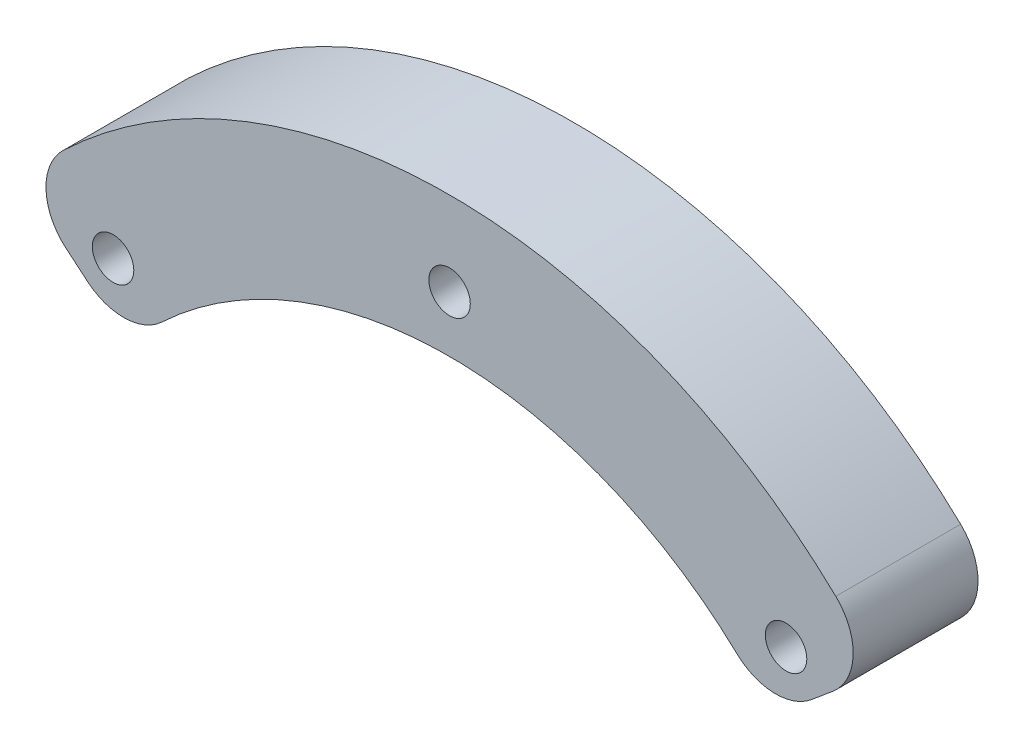
ISO-10303-21;
HEADER;
FILE_DESCRIPTION(('STEP AP214'),'2;1');
FILE_NAME('part.step','',(''),(''),'','','');
FILE_SCHEMA(('AUTOMOTIVE_DESIGN { 1 0 10303 214 1 1 1 1 }'));
ENDSEC;
DATA;
#1=APPLICATION_CONTEXT('core data for automotive mechanical design processes');
#2=APPLICATION_PROTOCOL_DEFINITION('international standard','automotive_design',2000,#1);
#3=PRODUCT_CONTEXT('',#1,'mechanical');
#4=PRODUCT('Part','Part','',(#3));
#5=PRODUCT_RELATED_PRODUCT_CATEGORY('part','',(#4));
#6=PRODUCT_DEFINITION_FORMATION('','',#4);
#7=PRODUCT_DEFINITION_CONTEXT('part definition',#1,'design');
#8=PRODUCT_DEFINITION('design','',#6,#7);
#9=PRODUCT_DEFINITION_SHAPE('','',#8);
#10=(LENGTH_UNIT() NAMED_UNIT(*) SI_UNIT(.MILLI.,.METRE.));
#11=(NAMED_UNIT(*) PLANE_ANGLE_UNIT() SI_UNIT($,.RADIAN.));
#12=(NAMED_UNIT(*) SI_UNIT($,.STERADIAN.) SOLID_ANGLE_UNIT());
#13=UNCERTAINTY_MEASURE_WITH_UNIT(LENGTH_MEASURE(1.E-05),#10,'distance_accuracy_value','');
#14=(GEOMETRIC_REPRESENTATION_CONTEXT(3) GLOBAL_UNCERTAINTY_ASSIGNED_CONTEXT((#13)) GLOBAL_UNIT_ASSIGNED_CONTEXT((#10,
#11,#12)) REPRESENTATION_CONTEXT('',''));
#15=CARTESIAN_POINT('',(0.,0.,0.));
#16=DIRECTION('',(0.,0.,1.));
#17=DIRECTION('',(1.,0.,0.));
#18=AXIS2_PLACEMENT_3D('',#15,#16,#17);
#19=CARTESIAN_POINT('',(0.,0.,11.15));
#20=DIRECTION('',(-0.642787609686544,0.766044443118974,0.));
#21=DIRECTION('',(-0.766044443118974,-0.642787609686544,0.));
#22=AXIS2_PLACEMENT_3D('',#19,#20,#21);
#23=PLANE('',#22);
#24=DIRECTION('',(0.766044443118974,0.642787609686544,0.));
#25=VECTOR('',#24,1.);
#26=CARTESIAN_POINT('',(0.,0.,0.));
#27=LINE('',#26,#25);
#28=CARTESIAN_POINT('',(32.3307965914018,27.1287594955132,0.));
#29=VERTEX_POINT('',#28);
#30=CARTESIAN_POINT('',(34.258548972,28.7463358070743,0.));
#31=VERTEX_POINT('',#30);
#32=EDGE_CURVE('E143',#29,#31,#27,.T.);
#33=ORIENTED_EDGE('',*,*,#32,.T.);
#34=DIRECTION('',(0.,0.,-1.));
#35=VECTOR('',#34,1.);
#36=CARTESIAN_POINT('',(34.258548972,28.7463358070743,11.15));
#37=LINE('',#36,#35);
#38=CARTESIAN_POINT('',(34.258548972,28.7463358070743,11.15));
#39=VERTEX_POINT('',#38);
#40=EDGE_CURVE('E117',#31,#39,#37,.F.);
#41=ORIENTED_EDGE('',*,*,#40,.T.);
#42=DIRECTION('',(0.766044443118974,0.642787609686544,0.));
#43=VECTOR('',#42,1.);
#44=CARTESIAN_POINT('',(0.,0.,11.15));
#45=LINE('',#44,#43);
#46=CARTESIAN_POINT('',(32.3307965914018,27.1287594955132,11.15));
#47=VERTEX_POINT('',#46);
#48=EDGE_CURVE('E269',#47,#39,#45,.T.);
#49=ORIENTED_EDGE('',*,*,#48,.F.);
#50=DIRECTION('',(0.,0.,1.));
#51=VECTOR('',#50,1.);
#52=CARTESIAN_POINT('',(32.3307965914018,27.1287594955132,0.));
#53=LINE('',#52,#51);
#54=EDGE_CURVE('E123',#47,#29,#53,.F.);
#55=ORIENTED_EDGE('',*,*,#54,.T.);
#56=EDGE_LOOP('',(#33,#41,#49,#55));
#57=FACE_BOUND('',#56,.T.);
#58=ADVANCED_FACE('F45',(#57),#23,.F.);
#59=CARTESIAN_POINT('',(0.,0.,11.15));
#60=DIRECTION('',(0.,0.,-1.));
#61=DIRECTION('',(-1.,0.,0.));
#62=AXIS2_PLACEMENT_3D('',#59,#60,#61);
#63=CYLINDRICAL_SURFACE('',#62,50.);
#64=CARTESIAN_POINT('',(0.,0.,11.15));
#65=DIRECTION('',(0.,0.,1.));
#66=DIRECTION('',(1.,0.,0.));
#67=AXIS2_PLACEMENT_3D('',#64,#65,#66);
#68=CIRCLE('',#67,50.);
#69=CARTESIAN_POINT('',(34.4940121372969,36.1961755807435,11.15));
#70=VERTEX_POINT('',#69);
#71=CARTESIAN_POINT('',(-34.494012137297,36.1961755807435,11.15));
#72=VERTEX_POINT('',#71);
#73=EDGE_CURVE('E133',#70,#72,#68,.T.);
#74=ORIENTED_EDGE('',*,*,#73,.F.);
#75=DIRECTION('',(0.,0.,-1.));
#76=VECTOR('',#75,1.);
#77=CARTESIAN_POINT('',(34.4940121372969,36.1961755807435,11.15));
#78=LINE('',#77,#76);
#79=CARTESIAN_POINT('',(34.4940121372969,36.1961755807435,0.));
#80=VERTEX_POINT('',#79);
#81=EDGE_CURVE('E116',#70,#80,#78,.T.);
#82=ORIENTED_EDGE('',*,*,#81,.T.);
#83=CARTESIAN_POINT('',(0.,0.,0.));
#84=DIRECTION('',(0.,0.,1.));
#85=DIRECTION('',(1.,0.,0.));
#86=AXIS2_PLACEMENT_3D('',#83,#84,#85);
#87=CIRCLE('',#86,50.);
#88=CARTESIAN_POINT('',(-34.494012137297,36.1961755807435,0.));
#89=VERTEX_POINT('',#88);
#90=EDGE_CURVE('E130',#80,#89,#87,.T.);
#91=ORIENTED_EDGE('',*,*,#90,.T.);
#92=DIRECTION('',(0.,0.,-1.));
#93=VECTOR('',#92,1.);
#94=CARTESIAN_POINT('',(-34.494012137297,36.1961755807435,11.15));
#95=LINE('',#94,#93);
#96=EDGE_CURVE('E136',#89,#72,#95,.F.);
#97=ORIENTED_EDGE('',*,*,#96,.T.);
#98=EDGE_LOOP('',(#74,#82,#91,#97));
#99=FACE_BOUND('',#98,.T.);
#100=ADVANCED_FACE('F129',(#99),#63,.T.);
#101=CARTESIAN_POINT('',(0.,0.,11.15));
#102=DIRECTION('',(-0.642787609686543,-0.766044443118975,0.));
#103=DIRECTION('',(0.766044443118975,-0.642787609686543,0.));
#104=AXIS2_PLACEMENT_3D('',#101,#102,#103);
#105=PLANE('',#104);
#106=DIRECTION('',(-0.766044443118975,0.642787609686543,0.));
#107=VECTOR('',#106,1.);
#108=CARTESIAN_POINT('',(0.,0.,0.));
#109=LINE('',#108,#107);
#110=CARTESIAN_POINT('',(-32.3307965914018,27.1287594955132,0.));
#111=VERTEX_POINT('',#110);
#112=CARTESIAN_POINT('',(-34.258548972,28.7463358070743,0.));
#113=VERTEX_POINT('',#112);
#114=EDGE_CURVE('E142',#111,#113,#109,.T.);
#115=ORIENTED_EDGE('',*,*,#114,.F.);
#116=DIRECTION('',(0.,0.,-1.));
#117=VECTOR('',#116,1.);
#118=CARTESIAN_POINT('',(-32.3307965914018,27.1287594955132,11.15));
#119=LINE('',#118,#117);
#120=CARTESIAN_POINT('',(-32.3307965914018,27.1287594955132,11.15));
#121=VERTEX_POINT('',#120);
#122=EDGE_CURVE('E11',#111,#121,#119,.F.);
#123=ORIENTED_EDGE('',*,*,#122,.T.);
#124=DIRECTION('',(-0.766044443118975,0.642787609686543,0.));
#125=VECTOR('',#124,1.);
#126=CARTESIAN_POINT('',(0.,0.,11.15));
#127=LINE('',#126,#125);
#128=CARTESIAN_POINT('',(-34.258548972,28.7463358070743,11.15));
#129=VERTEX_POINT('',#128);
#130=EDGE_CURVE('E204',#121,#129,#127,.T.);
#131=ORIENTED_EDGE('',*,*,#130,.T.);
#132=DIRECTION('',(0.,0.,1.));
#133=VECTOR('',#132,1.);
#134=CARTESIAN_POINT('',(-34.258548972,28.7463358070743,0.));
#135=LINE('',#134,#133);
#136=EDGE_CURVE('E54',#129,#113,#135,.F.);
#137=ORIENTED_EDGE('',*,*,#136,.T.);
#138=EDGE_LOOP('',(#115,#123,#131,#137));
#139=FACE_BOUND('',#138,.T.);
#140=ADVANCED_FACE('F202',(#139),#105,.T.);
#141=CARTESIAN_POINT('',(-30.0520382004283,30.0520382004283,11.15));
#142=DIRECTION('',(0.,0.,-1.));
#143=DIRECTION('',(-1.,0.,0.));
#144=AXIS2_PLACEMENT_3D('',#141,#142,#143);
#145=CYLINDRICAL_SURFACE('',#144,1.85);
#146=CARTESIAN_POINT('',(-30.0520382004283,30.0520382004283,11.15));
#147=DIRECTION('',(0.,0.,1.));
#148=DIRECTION('',(1.,0.,0.));
#149=AXIS2_PLACEMENT_3D('',#146,#147,#148);
#150=CIRCLE('',#149,1.85);
#151=CARTESIAN_POINT('',(-28.2020382004283,30.0520382004283,11.15));
#152=VERTEX_POINT('',#151);
#153=EDGE_CURVE('E214',#152,#152,#150,.T.);
#154=ORIENTED_EDGE('',*,*,#153,.T.);
#155=EDGE_LOOP('',(#154));
#156=FACE_BOUND('',#155,.T.);
#157=CARTESIAN_POINT('',(-30.0520382004283,30.0520382004283,0.));
#158=DIRECTION('',(0.,0.,1.));
#159=DIRECTION('',(1.,0.,0.));
#160=AXIS2_PLACEMENT_3D('',#157,#158,#159);
#161=CIRCLE('',#160,1.85);
#162=CARTESIAN_POINT('',(-28.2020382004283,30.0520382004283,0.));
#163=VERTEX_POINT('',#162);
#164=EDGE_CURVE('E156',#163,#163,#161,.T.);
#165=ORIENTED_EDGE('',*,*,#164,.F.);
#166=EDGE_LOOP('',(#165));
#167=FACE_BOUND('',#166,.T.);
#168=ADVANCED_FACE('F242',(#156,#167),#145,.F.);
#169=CARTESIAN_POINT('',(0.,0.,11.15));
#170=DIRECTION('',(0.,0.,-1.));
#171=DIRECTION('',(-1.,0.,0.));
#172=AXIS2_PLACEMENT_3D('',#169,#170,#171);
#173=CYLINDRICAL_SURFACE('',#172,37.5);
#174=CARTESIAN_POINT('',(0.,0.,0.));
#175=DIRECTION('',(0.,0.,1.));
#176=DIRECTION('',(1.,0.,0.));
#177=AXIS2_PLACEMENT_3D('',#174,#175,#176);
#178=CIRCLE('',#177,37.5);
#179=CARTESIAN_POINT('',(25.691345773208,27.3167485686248,0.));
#180=VERTEX_POINT('',#179);
#181=CARTESIAN_POINT('',(-25.6913457732081,27.3167485686248,0.));
#182=VERTEX_POINT('',#181);
#183=EDGE_CURVE('E147',#180,#182,#178,.T.);
#184=ORIENTED_EDGE('',*,*,#183,.F.);
#185=DIRECTION('',(0.,0.,-1.));
#186=VECTOR('',#185,1.);
#187=CARTESIAN_POINT('',(25.691345773208,27.3167485686248,11.15));
#188=LINE('',#187,#186);
#189=CARTESIAN_POINT('',(25.691345773208,27.3167485686248,11.15));
#190=VERTEX_POINT('',#189);
#191=EDGE_CURVE('E68',#180,#190,#188,.F.);
#192=ORIENTED_EDGE('',*,*,#191,.T.);
#193=CARTESIAN_POINT('',(0.,0.,11.15));
#194=DIRECTION('',(0.,0.,1.));
#195=DIRECTION('',(1.,0.,0.));
#196=AXIS2_PLACEMENT_3D('',#193,#194,#195);
#197=CIRCLE('',#196,37.5);
#198=CARTESIAN_POINT('',(-25.6913457732081,27.3167485686248,11.15));
#199=VERTEX_POINT('',#198);
#200=EDGE_CURVE('E211',#190,#199,#197,.T.);
#201=ORIENTED_EDGE('',*,*,#200,.T.);
#202=DIRECTION('',(0.,0.,-1.));
#203=VECTOR('',#202,1.);
#204=CARTESIAN_POINT('',(-25.6913457732081,27.3167485686248,11.15));
#205=LINE('',#204,#203);
#206=EDGE_CURVE('E191',#199,#182,#205,.T.);
#207=ORIENTED_EDGE('',*,*,#206,.T.);
#208=EDGE_LOOP('',(#184,#192,#201,#207));
#209=FACE_BOUND('',#208,.T.);
#210=ADVANCED_FACE('F210',(#209),#173,.F.);
#211=CARTESIAN_POINT('',(0.,42.5,11.15));
#212=DIRECTION('',(0.,0.,-1.));
#213=DIRECTION('',(-1.,0.,0.));
#214=AXIS2_PLACEMENT_3D('',#211,#212,#213);
#215=CYLINDRICAL_SURFACE('',#214,1.85);
#216=CARTESIAN_POINT('',(0.,42.5,11.15));
#217=DIRECTION('',(0.,0.,1.));
#218=DIRECTION('',(1.,0.,0.));
#219=AXIS2_PLACEMENT_3D('',#216,#217,#218);
#220=CIRCLE('',#219,1.85);
#221=CARTESIAN_POINT('',(1.84999999999999,42.5,11.15));
#222=VERTEX_POINT('',#221);
#223=EDGE_CURVE('E164',#222,#222,#220,.T.);
#224=ORIENTED_EDGE('',*,*,#223,.T.);
#225=EDGE_LOOP('',(#224));
#226=FACE_BOUND('',#225,.T.);
#227=CARTESIAN_POINT('',(0.,42.5,0.));
#228=DIRECTION('',(0.,0.,1.));
#229=DIRECTION('',(1.,0.,0.));
#230=AXIS2_PLACEMENT_3D('',#227,#228,#229);
#231=CIRCLE('',#230,1.85);
#232=CARTESIAN_POINT('',(1.84999999999999,42.5,0.));
#233=VERTEX_POINT('',#232);
#234=EDGE_CURVE('E149',#233,#233,#231,.T.);
#235=ORIENTED_EDGE('',*,*,#234,.F.);
#236=EDGE_LOOP('',(#235));
#237=FACE_BOUND('',#236,.T.);
#238=ADVANCED_FACE('F230',(#226,#237),#215,.F.);
#239=CARTESIAN_POINT('',(30.0520382004283,30.0520382004283,11.15));
#240=DIRECTION('',(0.,0.,-1.));
#241=DIRECTION('',(-1.,0.,0.));
#242=AXIS2_PLACEMENT_3D('',#239,#240,#241);
#243=CYLINDRICAL_SURFACE('',#242,1.85);
#244=CARTESIAN_POINT('',(30.0520382004283,30.0520382004283,11.15));
#245=DIRECTION('',(0.,0.,1.));
#246=DIRECTION('',(1.,0.,0.));
#247=AXIS2_PLACEMENT_3D('',#244,#245,#246);
#248=CIRCLE('',#247,1.85);
#249=CARTESIAN_POINT('',(31.9020382004283,30.0520382004283,11.15));
#250=VERTEX_POINT('',#249);
#251=EDGE_CURVE('E166',#250,#250,#248,.T.);
#252=ORIENTED_EDGE('',*,*,#251,.T.);
#253=EDGE_LOOP('',(#252));
#254=FACE_BOUND('',#253,.T.);
#255=CARTESIAN_POINT('',(30.0520382004283,30.0520382004283,0.));
#256=DIRECTION('',(0.,0.,1.));
#257=DIRECTION('',(1.,0.,0.));
#258=AXIS2_PLACEMENT_3D('',#255,#256,#257);
#259=CIRCLE('',#258,1.85);
#260=CARTESIAN_POINT('',(31.9020382004283,30.0520382004283,0.));
#261=VERTEX_POINT('',#260);
#262=EDGE_CURVE('E160',#261,#261,#259,.T.);
#263=ORIENTED_EDGE('',*,*,#262,.F.);
#264=EDGE_LOOP('',(#263));
#265=FACE_BOUND('',#264,.T.);
#266=ADVANCED_FACE('F232',(#254,#265),#243,.F.);
#267=CARTESIAN_POINT('',(0.,0.,11.15));
#268=DIRECTION('',(0.,0.,1.));
#269=DIRECTION('',(1.,0.,0.));
#270=AXIS2_PLACEMENT_3D('',#267,#268,#269);
#271=PLANE('',#270);
#272=ORIENTED_EDGE('',*,*,#223,.F.);
#273=EDGE_LOOP('',(#272));
#274=FACE_BOUND('',#273,.T.);
#275=ORIENTED_EDGE('',*,*,#48,.T.);
#276=CARTESIAN_POINT('',(31.0446109235672,32.5765580226692,11.15));
#277=DIRECTION('',(0.,0.,1.));
#278=DIRECTION('',(1.,0.,0.));
#279=AXIS2_PLACEMENT_3D('',#276,#277,#278);
#280=CIRCLE('',#279,5.);
#281=EDGE_CURVE('E188',#39,#70,#280,.T.);
#282=ORIENTED_EDGE('',*,*,#281,.T.);
#283=ORIENTED_EDGE('',*,*,#73,.T.);
#284=CARTESIAN_POINT('',(-31.0446109235673,32.5765580226691,11.15));
#285=DIRECTION('',(0.,0.,1.));
#286=DIRECTION('',(1.,0.,0.));
#287=AXIS2_PLACEMENT_3D('',#284,#285,#286);
#288=CIRCLE('',#287,5.);
#289=EDGE_CURVE('E180',#72,#129,#288,.T.);
#290=ORIENTED_EDGE('',*,*,#289,.T.);
#291=ORIENTED_EDGE('',*,*,#130,.F.);
#292=CARTESIAN_POINT('',(-29.1168585429691,30.9589817111081,11.15));
#293=DIRECTION('',(0.,0.,1.));
#294=DIRECTION('',(1.,0.,0.));
#295=AXIS2_PLACEMENT_3D('',#292,#293,#294);
#296=CIRCLE('',#295,5.);
#297=EDGE_CURVE('E61',#121,#199,#296,.T.);
#298=ORIENTED_EDGE('',*,*,#297,.T.);
#299=ORIENTED_EDGE('',*,*,#200,.F.);
#300=CARTESIAN_POINT('',(29.1168585429691,30.9589817111081,11.15));
#301=DIRECTION('',(0.,0.,1.));
#302=DIRECTION('',(1.,0.,0.));
#303=AXIS2_PLACEMENT_3D('',#300,#301,#302);
#304=CIRCLE('',#303,5.);
#305=EDGE_CURVE('E185',#190,#47,#304,.T.);
#306=ORIENTED_EDGE('',*,*,#305,.T.);
#307=EDGE_LOOP('',(#275,#282,#283,#290,#291,#298,#299,#306));
#308=FACE_BOUND('',#307,.T.);
#309=ORIENTED_EDGE('',*,*,#153,.F.);
#310=EDGE_LOOP('',(#309));
#311=FACE_BOUND('',#310,.T.);
#312=ORIENTED_EDGE('',*,*,#251,.F.);
#313=EDGE_LOOP('',(#312));
#314=FACE_BOUND('',#313,.T.);
#315=ADVANCED_FACE('F239',(#274,#308,#311,#314),#271,.T.);
#316=CARTESIAN_POINT('',(0.,0.,0.));
#317=DIRECTION('',(0.,0.,1.));
#318=DIRECTION('',(1.,0.,0.));
#319=AXIS2_PLACEMENT_3D('',#316,#317,#318);
#320=PLANE('',#319);
#321=ORIENTED_EDGE('',*,*,#234,.T.);
#322=EDGE_LOOP('',(#321));
#323=FACE_BOUND('',#322,.T.);
#324=ORIENTED_EDGE('',*,*,#90,.F.);
#325=CARTESIAN_POINT('',(31.0446109235672,32.5765580226692,0.));
#326=DIRECTION('',(0.,0.,1.));
#327=DIRECTION('',(1.,0.,0.));
#328=AXIS2_PLACEMENT_3D('',#325,#326,#327);
#329=CIRCLE('',#328,5.);
#330=EDGE_CURVE('E112',#80,#31,#329,.F.);
#331=ORIENTED_EDGE('',*,*,#330,.T.);
#332=ORIENTED_EDGE('',*,*,#32,.F.);
#333=CARTESIAN_POINT('',(29.1168585429691,30.9589817111081,0.));
#334=DIRECTION('',(0.,0.,1.));
#335=DIRECTION('',(1.,0.,0.));
#336=AXIS2_PLACEMENT_3D('',#333,#334,#335);
#337=CIRCLE('',#336,5.);
#338=EDGE_CURVE('E124',#29,#180,#337,.F.);
#339=ORIENTED_EDGE('',*,*,#338,.T.);
#340=ORIENTED_EDGE('',*,*,#183,.T.);
#341=CARTESIAN_POINT('',(-29.1168585429691,30.9589817111081,0.));
#342=DIRECTION('',(0.,0.,1.));
#343=DIRECTION('',(1.,0.,0.));
#344=AXIS2_PLACEMENT_3D('',#341,#342,#343);
#345=CIRCLE('',#344,5.);
#346=EDGE_CURVE('E170',#182,#111,#345,.F.);
#347=ORIENTED_EDGE('',*,*,#346,.T.);
#348=ORIENTED_EDGE('',*,*,#114,.T.);
#349=CARTESIAN_POINT('',(-31.0446109235673,32.5765580226691,0.));
#350=DIRECTION('',(0.,0.,1.));
#351=DIRECTION('',(1.,0.,0.));
#352=AXIS2_PLACEMENT_3D('',#349,#350,#351);
#353=CIRCLE('',#352,5.);
#354=EDGE_CURVE('E135',#113,#89,#353,.F.);
#355=ORIENTED_EDGE('',*,*,#354,.T.);
#356=EDGE_LOOP('',(#324,#331,#332,#339,#340,#347,#348,#355));
#357=FACE_BOUND('',#356,.T.);
#358=ORIENTED_EDGE('',*,*,#164,.T.);
#359=EDGE_LOOP('',(#358));
#360=FACE_BOUND('',#359,.T.);
#361=ORIENTED_EDGE('',*,*,#262,.T.);
#362=EDGE_LOOP('',(#361));
#363=FACE_BOUND('',#362,.T.);
#364=ADVANCED_FACE('F138',(#323,#357,#360,#363),#320,.F.);
#365=CARTESIAN_POINT('',(31.0446109235672,32.5765580226692,11.15));
#366=DIRECTION('',(0.,0.,-1.));
#367=DIRECTION('',(-1.,0.,0.));
#368=AXIS2_PLACEMENT_3D('',#365,#366,#367);
#369=CYLINDRICAL_SURFACE('',#368,5.);
#370=ORIENTED_EDGE('',*,*,#281,.F.);
#371=ORIENTED_EDGE('',*,*,#40,.F.);
#372=ORIENTED_EDGE('',*,*,#330,.F.);
#373=ORIENTED_EDGE('',*,*,#81,.F.);
#374=EDGE_LOOP('',(#370,#371,#372,#373));
#375=FACE_BOUND('',#374,.T.);
#376=ADVANCED_FACE('F115',(#375),#369,.T.);
#377=CARTESIAN_POINT('',(29.1168585429691,30.9589817111081,11.15));
#378=DIRECTION('',(0.,0.,-1.));
#379=DIRECTION('',(-1.,0.,0.));
#380=AXIS2_PLACEMENT_3D('',#377,#378,#379);
#381=CYLINDRICAL_SURFACE('',#380,5.);
#382=ORIENTED_EDGE('',*,*,#305,.F.);
#383=ORIENTED_EDGE('',*,*,#191,.F.);
#384=ORIENTED_EDGE('',*,*,#338,.F.);
#385=ORIENTED_EDGE('',*,*,#54,.F.);
#386=EDGE_LOOP('',(#382,#383,#384,#385));
#387=FACE_BOUND('',#386,.T.);
#388=ADVANCED_FACE('F288',(#387),#381,.T.);
#389=CARTESIAN_POINT('',(-29.1168585429691,30.9589817111081,11.15));
#390=DIRECTION('',(0.,0.,-1.));
#391=DIRECTION('',(-1.,0.,0.));
#392=AXIS2_PLACEMENT_3D('',#389,#390,#391);
#393=CYLINDRICAL_SURFACE('',#392,5.);
#394=ORIENTED_EDGE('',*,*,#297,.F.);
#395=ORIENTED_EDGE('',*,*,#122,.F.);
#396=ORIENTED_EDGE('',*,*,#346,.F.);
#397=ORIENTED_EDGE('',*,*,#206,.F.);
#398=EDGE_LOOP('',(#394,#395,#396,#397));
#399=FACE_BOUND('',#398,.T.);
#400=ADVANCED_FACE('F209',(#399),#393,.T.);
#401=CARTESIAN_POINT('',(-31.0446109235673,32.5765580226691,11.15));
#402=DIRECTION('',(0.,0.,-1.));
#403=DIRECTION('',(-1.,0.,0.));
#404=AXIS2_PLACEMENT_3D('',#401,#402,#403);
#405=CYLINDRICAL_SURFACE('',#404,5.);
#406=ORIENTED_EDGE('',*,*,#289,.F.);
#407=ORIENTED_EDGE('',*,*,#96,.F.);
#408=ORIENTED_EDGE('',*,*,#354,.F.);
#409=ORIENTED_EDGE('',*,*,#136,.F.);
#410=EDGE_LOOP('',(#406,#407,#408,#409));
#411=FACE_BOUND('',#410,.T.);
#412=ADVANCED_FACE('F47',(#411),#405,.T.);
#413=CLOSED_SHELL('',(#58,#100,#140,#168,#210,#238,#266,#315,#364,#376,#388,#400,#412));
#414=MANIFOLD_SOLID_BREP('B2',#413);
#415=ADVANCED_BREP_SHAPE_REPRESENTATION('',(#18,#414),#14);
#416=SHAPE_DEFINITION_REPRESENTATION(#9,#415);
ENDSEC;
END-ISO-10303-21;
